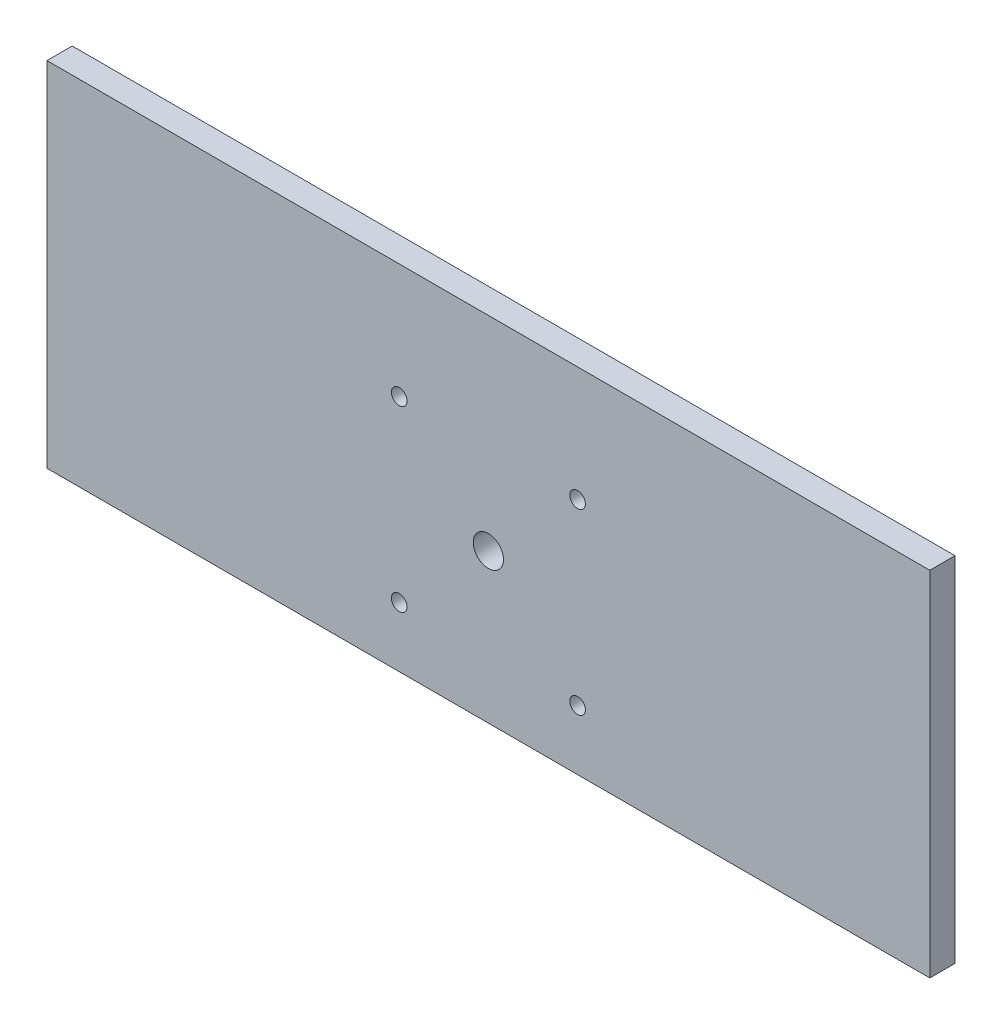
ISO-10303-21;
HEADER;
FILE_DESCRIPTION(('STEP AP214'),'2;1');
FILE_NAME('part.step','',(''),(''),'','','');
FILE_SCHEMA(('AUTOMOTIVE_DESIGN { 1 0 10303 214 1 1 1 1 }'));
ENDSEC;
DATA;
#1=APPLICATION_CONTEXT('core data for automotive mechanical design processes');
#2=APPLICATION_PROTOCOL_DEFINITION('international standard','automotive_design',2000,#1);
#3=PRODUCT_CONTEXT('',#1,'mechanical');
#4=PRODUCT('Part','Part','',(#3));
#5=PRODUCT_RELATED_PRODUCT_CATEGORY('part','',(#4));
#6=PRODUCT_DEFINITION_FORMATION('','',#4);
#7=PRODUCT_DEFINITION_CONTEXT('part definition',#1,'design');
#8=PRODUCT_DEFINITION('design','',#6,#7);
#9=PRODUCT_DEFINITION_SHAPE('','',#8);
#10=(LENGTH_UNIT() NAMED_UNIT(*) SI_UNIT(.MILLI.,.METRE.));
#11=(NAMED_UNIT(*) PLANE_ANGLE_UNIT() SI_UNIT($,.RADIAN.));
#12=(NAMED_UNIT(*) SI_UNIT($,.STERADIAN.) SOLID_ANGLE_UNIT());
#13=UNCERTAINTY_MEASURE_WITH_UNIT(LENGTH_MEASURE(1.E-05),#10,'distance_accuracy_value','');
#14=(GEOMETRIC_REPRESENTATION_CONTEXT(3) GLOBAL_UNCERTAINTY_ASSIGNED_CONTEXT((#13)) GLOBAL_UNIT_ASSIGNED_CONTEXT((#10,
#11,#12)) REPRESENTATION_CONTEXT('',''));
#15=CARTESIAN_POINT('',(0.,0.,0.));
#16=DIRECTION('',(0.,0.,1.));
#17=DIRECTION('',(1.,0.,0.));
#18=AXIS2_PLACEMENT_3D('',#15,#16,#17);
#19=CARTESIAN_POINT('',(175.,-25.,5.));
#20=DIRECTION('',(-1.,0.,0.));
#21=DIRECTION('',(0.,0.,1.));
#22=AXIS2_PLACEMENT_3D('',#19,#20,#21);
#23=PLANE('',#22);
#24=DIRECTION('',(0.,1.,0.));
#25=VECTOR('',#24,1.);
#26=CARTESIAN_POINT('',(175.,-25.,0.));
#27=LINE('',#26,#25);
#28=CARTESIAN_POINT('',(175.,-95.,0.));
#29=VERTEX_POINT('',#28);
#30=CARTESIAN_POINT('',(175.,-25.,0.));
#31=VERTEX_POINT('',#30);
#32=EDGE_CURVE('E103',#29,#31,#27,.T.);
#33=ORIENTED_EDGE('',*,*,#32,.T.);
#34=DIRECTION('',(0.,0.,-1.));
#35=VECTOR('',#34,1.);
#36=CARTESIAN_POINT('',(175.,-25.,5.));
#37=LINE('',#36,#35);
#38=CARTESIAN_POINT('',(175.,-25.,5.));
#39=VERTEX_POINT('',#38);
#40=EDGE_CURVE('E11',#39,#31,#37,.T.);
#41=ORIENTED_EDGE('',*,*,#40,.F.);
#42=DIRECTION('',(0.,1.,0.));
#43=VECTOR('',#42,1.);
#44=CARTESIAN_POINT('',(175.,-25.,5.));
#45=LINE('',#44,#43);
#46=CARTESIAN_POINT('',(175.,-95.,5.));
#47=VERTEX_POINT('',#46);
#48=EDGE_CURVE('E90',#47,#39,#45,.T.);
#49=ORIENTED_EDGE('',*,*,#48,.F.);
#50=DIRECTION('',(0.,0.,-1.));
#51=VECTOR('',#50,1.);
#52=CARTESIAN_POINT('',(175.,-95.,5.));
#53=LINE('',#52,#51);
#54=EDGE_CURVE('E99',#47,#29,#53,.T.);
#55=ORIENTED_EDGE('',*,*,#54,.T.);
#56=EDGE_LOOP('',(#33,#41,#49,#55));
#57=FACE_BOUND('',#56,.T.);
#58=ADVANCED_FACE('F37',(#57),#23,.F.);
#59=CARTESIAN_POINT('',(0.,-25.,5.));
#60=DIRECTION('',(0.,-1.,0.));
#61=DIRECTION('',(0.,0.,-1.));
#62=AXIS2_PLACEMENT_3D('',#59,#60,#61);
#63=PLANE('',#62);
#64=DIRECTION('',(-1.,0.,0.));
#65=VECTOR('',#64,1.);
#66=CARTESIAN_POINT('',(0.,-25.,0.));
#67=LINE('',#66,#65);
#68=CARTESIAN_POINT('',(0.,-25.,0.));
#69=VERTEX_POINT('',#68);
#70=EDGE_CURVE('E94',#31,#69,#67,.T.);
#71=ORIENTED_EDGE('',*,*,#70,.T.);
#72=DIRECTION('',(0.,0.,-1.));
#73=VECTOR('',#72,1.);
#74=CARTESIAN_POINT('',(0.,-25.,5.));
#75=LINE('',#74,#73);
#76=CARTESIAN_POINT('',(0.,-25.,5.));
#77=VERTEX_POINT('',#76);
#78=EDGE_CURVE('E46',#77,#69,#75,.T.);
#79=ORIENTED_EDGE('',*,*,#78,.F.);
#80=DIRECTION('',(-1.,0.,0.));
#81=VECTOR('',#80,1.);
#82=CARTESIAN_POINT('',(0.,-25.,5.));
#83=LINE('',#82,#81);
#84=EDGE_CURVE('E85',#39,#77,#83,.T.);
#85=ORIENTED_EDGE('',*,*,#84,.F.);
#86=ORIENTED_EDGE('',*,*,#40,.T.);
#87=EDGE_LOOP('',(#71,#79,#85,#86));
#88=FACE_BOUND('',#87,.T.);
#89=ADVANCED_FACE('F93',(#88),#63,.F.);
#90=CARTESIAN_POINT('',(0.,-25.,5.));
#91=DIRECTION('',(1.,0.,0.));
#92=DIRECTION('',(0.,1.,0.));
#93=AXIS2_PLACEMENT_3D('',#90,#91,#92);
#94=PLANE('',#93);
#95=DIRECTION('',(0.,-1.,0.));
#96=VECTOR('',#95,1.);
#97=CARTESIAN_POINT('',(0.,-25.,0.));
#98=LINE('',#97,#96);
#99=CARTESIAN_POINT('',(0.,-95.,0.));
#100=VERTEX_POINT('',#99);
#101=EDGE_CURVE('E72',#69,#100,#98,.T.);
#102=ORIENTED_EDGE('',*,*,#101,.T.);
#103=DIRECTION('',(0.,0.,-1.));
#104=VECTOR('',#103,1.);
#105=CARTESIAN_POINT('',(0.,-95.,5.));
#106=LINE('',#105,#104);
#107=CARTESIAN_POINT('',(0.,-95.,5.));
#108=VERTEX_POINT('',#107);
#109=EDGE_CURVE('E95',#108,#100,#106,.T.);
#110=ORIENTED_EDGE('',*,*,#109,.F.);
#111=DIRECTION('',(0.,-1.,0.));
#112=VECTOR('',#111,1.);
#113=CARTESIAN_POINT('',(0.,-25.,5.));
#114=LINE('',#113,#112);
#115=EDGE_CURVE('E88',#77,#108,#114,.T.);
#116=ORIENTED_EDGE('',*,*,#115,.F.);
#117=ORIENTED_EDGE('',*,*,#78,.T.);
#118=EDGE_LOOP('',(#102,#110,#116,#117));
#119=FACE_BOUND('',#118,.T.);
#120=ADVANCED_FACE('F97',(#119),#94,.F.);
#121=CARTESIAN_POINT('',(0.,-95.,5.));
#122=DIRECTION('',(0.,1.,0.));
#123=DIRECTION('',(0.,0.,1.));
#124=AXIS2_PLACEMENT_3D('',#121,#122,#123);
#125=PLANE('',#124);
#126=DIRECTION('',(1.,0.,0.));
#127=VECTOR('',#126,1.);
#128=CARTESIAN_POINT('',(0.,-95.,0.));
#129=LINE('',#128,#127);
#130=EDGE_CURVE('E78',#100,#29,#129,.T.);
#131=ORIENTED_EDGE('',*,*,#130,.T.);
#132=ORIENTED_EDGE('',*,*,#54,.F.);
#133=DIRECTION('',(1.,0.,0.));
#134=VECTOR('',#133,1.);
#135=CARTESIAN_POINT('',(0.,-95.,5.));
#136=LINE('',#135,#134);
#137=EDGE_CURVE('E55',#108,#47,#136,.T.);
#138=ORIENTED_EDGE('',*,*,#137,.F.);
#139=ORIENTED_EDGE('',*,*,#109,.T.);
#140=EDGE_LOOP('',(#131,#132,#138,#139));
#141=FACE_BOUND('',#140,.T.);
#142=ADVANCED_FACE('F151',(#141),#125,.F.);
#143=CARTESIAN_POINT('',(0.,0.,5.));
#144=DIRECTION('',(0.,0.,1.));
#145=DIRECTION('',(1.,0.,0.));
#146=AXIS2_PLACEMENT_3D('',#143,#144,#145);
#147=PLANE('',#146);
#148=CARTESIAN_POINT('',(69.8223304703361,-47.7723304703365,5.));
#149=DIRECTION('',(0.,0.,1.));
#150=DIRECTION('',(1.,0.,0.));
#151=AXIS2_PLACEMENT_3D('',#148,#149,#150);
#152=CIRCLE('',#151,1.54999999999999);
#153=CARTESIAN_POINT('',(71.3723304703361,-47.7723304703365,5.));
#154=VERTEX_POINT('',#153);
#155=EDGE_CURVE('E119',#154,#154,#152,.T.);
#156=ORIENTED_EDGE('',*,*,#155,.F.);
#157=EDGE_LOOP('',(#156));
#158=FACE_BOUND('',#157,.T.);
#159=CARTESIAN_POINT('',(105.177669529664,-47.7723304703365,5.));
#160=DIRECTION('',(0.,0.,1.));
#161=DIRECTION('',(1.,0.,0.));
#162=AXIS2_PLACEMENT_3D('',#159,#160,#161);
#163=CIRCLE('',#162,1.54999999999999);
#164=CARTESIAN_POINT('',(106.727669529664,-47.7723304703365,5.));
#165=VERTEX_POINT('',#164);
#166=EDGE_CURVE('E139',#165,#165,#163,.T.);
#167=ORIENTED_EDGE('',*,*,#166,.F.);
#168=EDGE_LOOP('',(#167));
#169=FACE_BOUND('',#168,.T.);
#170=CARTESIAN_POINT('',(105.177669529664,-83.1276695296635,5.));
#171=DIRECTION('',(0.,0.,1.));
#172=DIRECTION('',(1.,0.,0.));
#173=AXIS2_PLACEMENT_3D('',#170,#171,#172);
#174=CIRCLE('',#173,1.54999999999999);
#175=CARTESIAN_POINT('',(106.727669529664,-83.1276695296635,5.));
#176=VERTEX_POINT('',#175);
#177=EDGE_CURVE('E136',#176,#176,#174,.T.);
#178=ORIENTED_EDGE('',*,*,#177,.F.);
#179=EDGE_LOOP('',(#178));
#180=FACE_BOUND('',#179,.T.);
#181=CARTESIAN_POINT('',(69.8223304703361,-83.1276695296635,5.));
#182=DIRECTION('',(0.,0.,1.));
#183=DIRECTION('',(1.,0.,0.));
#184=AXIS2_PLACEMENT_3D('',#181,#182,#183);
#185=CIRCLE('',#184,1.54999999999999);
#186=CARTESIAN_POINT('',(71.3723304703361,-83.1276695296635,5.));
#187=VERTEX_POINT('',#186);
#188=EDGE_CURVE('E133',#187,#187,#185,.T.);
#189=ORIENTED_EDGE('',*,*,#188,.F.);
#190=EDGE_LOOP('',(#189));
#191=FACE_BOUND('',#190,.T.);
#192=CARTESIAN_POINT('',(87.5,-65.45,5.));
#193=DIRECTION('',(0.,0.,1.));
#194=DIRECTION('',(1.,0.,0.));
#195=AXIS2_PLACEMENT_3D('',#192,#193,#194);
#196=CIRCLE('',#195,3.00000000000001);
#197=CARTESIAN_POINT('',(90.5,-65.45,5.));
#198=VERTEX_POINT('',#197);
#199=EDGE_CURVE('E114',#198,#198,#196,.T.);
#200=ORIENTED_EDGE('',*,*,#199,.F.);
#201=EDGE_LOOP('',(#200));
#202=FACE_BOUND('',#201,.T.);
#203=ORIENTED_EDGE('',*,*,#48,.T.);
#204=ORIENTED_EDGE('',*,*,#84,.T.);
#205=ORIENTED_EDGE('',*,*,#115,.T.);
#206=ORIENTED_EDGE('',*,*,#137,.T.);
#207=EDGE_LOOP('',(#203,#204,#205,#206));
#208=FACE_BOUND('',#207,.T.);
#209=ADVANCED_FACE('F86',(#158,#169,#180,#191,#202,#208),#147,.T.);
#210=CARTESIAN_POINT('',(0.,0.,0.));
#211=DIRECTION('',(0.,0.,1.));
#212=DIRECTION('',(1.,0.,0.));
#213=AXIS2_PLACEMENT_3D('',#210,#211,#212);
#214=PLANE('',#213);
#215=CARTESIAN_POINT('',(69.8223304703361,-47.7723304703365,0.));
#216=DIRECTION('',(0.,0.,1.));
#217=DIRECTION('',(1.,0.,0.));
#218=AXIS2_PLACEMENT_3D('',#215,#216,#217);
#219=CIRCLE('',#218,1.54999999999999);
#220=CARTESIAN_POINT('',(71.3723304703361,-47.7723304703365,0.));
#221=VERTEX_POINT('',#220);
#222=EDGE_CURVE('E40',#221,#221,#219,.T.);
#223=ORIENTED_EDGE('',*,*,#222,.T.);
#224=EDGE_LOOP('',(#223));
#225=FACE_BOUND('',#224,.T.);
#226=CARTESIAN_POINT('',(105.177669529664,-47.7723304703365,0.));
#227=DIRECTION('',(0.,0.,1.));
#228=DIRECTION('',(1.,0.,0.));
#229=AXIS2_PLACEMENT_3D('',#226,#227,#228);
#230=CIRCLE('',#229,1.54999999999999);
#231=CARTESIAN_POINT('',(106.727669529664,-47.7723304703365,0.));
#232=VERTEX_POINT('',#231);
#233=EDGE_CURVE('E121',#232,#232,#230,.T.);
#234=ORIENTED_EDGE('',*,*,#233,.T.);
#235=EDGE_LOOP('',(#234));
#236=FACE_BOUND('',#235,.T.);
#237=CARTESIAN_POINT('',(105.177669529664,-83.1276695296635,0.));
#238=DIRECTION('',(0.,0.,1.));
#239=DIRECTION('',(1.,0.,0.));
#240=AXIS2_PLACEMENT_3D('',#237,#238,#239);
#241=CIRCLE('',#240,1.54999999999999);
#242=CARTESIAN_POINT('',(106.727669529664,-83.1276695296635,0.));
#243=VERTEX_POINT('',#242);
#244=EDGE_CURVE('E118',#243,#243,#241,.T.);
#245=ORIENTED_EDGE('',*,*,#244,.T.);
#246=EDGE_LOOP('',(#245));
#247=FACE_BOUND('',#246,.T.);
#248=CARTESIAN_POINT('',(69.8223304703361,-83.1276695296635,0.));
#249=DIRECTION('',(0.,0.,1.));
#250=DIRECTION('',(1.,0.,0.));
#251=AXIS2_PLACEMENT_3D('',#248,#249,#250);
#252=CIRCLE('',#251,1.54999999999999);
#253=CARTESIAN_POINT('',(71.3723304703361,-83.1276695296635,0.));
#254=VERTEX_POINT('',#253);
#255=EDGE_CURVE('E115',#254,#254,#252,.T.);
#256=ORIENTED_EDGE('',*,*,#255,.T.);
#257=EDGE_LOOP('',(#256));
#258=FACE_BOUND('',#257,.T.);
#259=CARTESIAN_POINT('',(87.5,-65.45,0.));
#260=DIRECTION('',(0.,0.,1.));
#261=DIRECTION('',(1.,0.,0.));
#262=AXIS2_PLACEMENT_3D('',#259,#260,#261);
#263=CIRCLE('',#262,3.00000000000001);
#264=CARTESIAN_POINT('',(90.5,-65.45,0.));
#265=VERTEX_POINT('',#264);
#266=EDGE_CURVE('E106',#265,#265,#263,.T.);
#267=ORIENTED_EDGE('',*,*,#266,.T.);
#268=EDGE_LOOP('',(#267));
#269=FACE_BOUND('',#268,.T.);
#270=ORIENTED_EDGE('',*,*,#32,.F.);
#271=ORIENTED_EDGE('',*,*,#130,.F.);
#272=ORIENTED_EDGE('',*,*,#101,.F.);
#273=ORIENTED_EDGE('',*,*,#70,.F.);
#274=EDGE_LOOP('',(#270,#271,#272,#273));
#275=FACE_BOUND('',#274,.T.);
#276=ADVANCED_FACE('F150',(#225,#236,#247,#258,#269,#275),#214,.F.);
#277=CARTESIAN_POINT('',(87.5,-65.45,-5.));
#278=DIRECTION('',(0.,0.,1.));
#279=DIRECTION('',(1.,0.,0.));
#280=AXIS2_PLACEMENT_3D('',#277,#278,#279);
#281=CYLINDRICAL_SURFACE('',#280,3.00000000000001);
#282=ORIENTED_EDGE('',*,*,#199,.T.);
#283=EDGE_LOOP('',(#282));
#284=FACE_BOUND('',#283,.T.);
#285=ORIENTED_EDGE('',*,*,#266,.F.);
#286=EDGE_LOOP('',(#285));
#287=FACE_BOUND('',#286,.T.);
#288=ADVANCED_FACE('F164',(#284,#287),#281,.F.);
#289=CARTESIAN_POINT('',(69.8223304703361,-83.1276695296635,-5.));
#290=DIRECTION('',(0.,0.,1.));
#291=DIRECTION('',(1.,0.,0.));
#292=AXIS2_PLACEMENT_3D('',#289,#290,#291);
#293=CYLINDRICAL_SURFACE('',#292,1.54999999999999);
#294=ORIENTED_EDGE('',*,*,#188,.T.);
#295=EDGE_LOOP('',(#294));
#296=FACE_BOUND('',#295,.T.);
#297=ORIENTED_EDGE('',*,*,#255,.F.);
#298=EDGE_LOOP('',(#297));
#299=FACE_BOUND('',#298,.T.);
#300=ADVANCED_FACE('F160',(#296,#299),#293,.F.);
#301=CARTESIAN_POINT('',(105.177669529664,-83.1276695296635,-5.));
#302=DIRECTION('',(0.,0.,1.));
#303=DIRECTION('',(1.,0.,0.));
#304=AXIS2_PLACEMENT_3D('',#301,#302,#303);
#305=CYLINDRICAL_SURFACE('',#304,1.54999999999999);
#306=ORIENTED_EDGE('',*,*,#177,.T.);
#307=EDGE_LOOP('',(#306));
#308=FACE_BOUND('',#307,.T.);
#309=ORIENTED_EDGE('',*,*,#244,.F.);
#310=EDGE_LOOP('',(#309));
#311=FACE_BOUND('',#310,.T.);
#312=ADVANCED_FACE('F163',(#308,#311),#305,.F.);
#313=CARTESIAN_POINT('',(105.177669529664,-47.7723304703365,-5.));
#314=DIRECTION('',(0.,0.,1.));
#315=DIRECTION('',(1.,0.,0.));
#316=AXIS2_PLACEMENT_3D('',#313,#314,#315);
#317=CYLINDRICAL_SURFACE('',#316,1.54999999999999);
#318=ORIENTED_EDGE('',*,*,#166,.T.);
#319=EDGE_LOOP('',(#318));
#320=FACE_BOUND('',#319,.T.);
#321=ORIENTED_EDGE('',*,*,#233,.F.);
#322=EDGE_LOOP('',(#321));
#323=FACE_BOUND('',#322,.T.);
#324=ADVANCED_FACE('F232',(#320,#323),#317,.F.);
#325=CARTESIAN_POINT('',(69.8223304703361,-47.7723304703365,-5.));
#326=DIRECTION('',(0.,0.,1.));
#327=DIRECTION('',(1.,0.,0.));
#328=AXIS2_PLACEMENT_3D('',#325,#326,#327);
#329=CYLINDRICAL_SURFACE('',#328,1.54999999999999);
#330=ORIENTED_EDGE('',*,*,#155,.T.);
#331=EDGE_LOOP('',(#330));
#332=FACE_BOUND('',#331,.T.);
#333=ORIENTED_EDGE('',*,*,#222,.F.);
#334=EDGE_LOOP('',(#333));
#335=FACE_BOUND('',#334,.T.);
#336=ADVANCED_FACE('F145',(#332,#335),#329,.F.);
#337=CLOSED_SHELL('',(#58,#89,#120,#142,#209,#276,#288,#300,#312,#324,#336));
#338=MANIFOLD_SOLID_BREP('B2',#337);
#339=ADVANCED_BREP_SHAPE_REPRESENTATION('',(#18,#338),#14);
#340=SHAPE_DEFINITION_REPRESENTATION(#9,#339);
ENDSEC;
END-ISO-10303-21;
